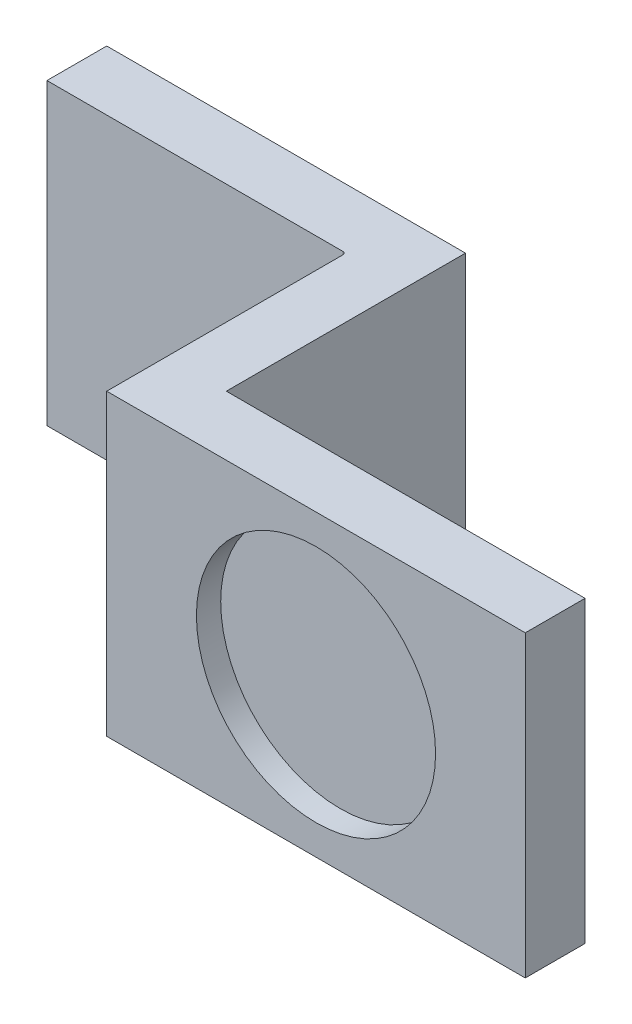
ISO-10303-21;
HEADER;
FILE_DESCRIPTION(('STEP AP214'),'2;1');
FILE_NAME('part.step','',(''),(''),'','','');
FILE_SCHEMA(('AUTOMOTIVE_DESIGN { 1 0 10303 214 1 1 1 1 }'));
ENDSEC;
DATA;
#1=APPLICATION_CONTEXT('core data for automotive mechanical design processes');
#2=APPLICATION_PROTOCOL_DEFINITION('international standard','automotive_design',2000,#1);
#3=PRODUCT_CONTEXT('',#1,'mechanical');
#4=PRODUCT('Part','Part','',(#3));
#5=PRODUCT_RELATED_PRODUCT_CATEGORY('part','',(#4));
#6=PRODUCT_DEFINITION_FORMATION('','',#4);
#7=PRODUCT_DEFINITION_CONTEXT('part definition',#1,'design');
#8=PRODUCT_DEFINITION('design','',#6,#7);
#9=PRODUCT_DEFINITION_SHAPE('','',#8);
#10=(LENGTH_UNIT() NAMED_UNIT(*) SI_UNIT(.MILLI.,.METRE.));
#11=(NAMED_UNIT(*) PLANE_ANGLE_UNIT() SI_UNIT($,.RADIAN.));
#12=(NAMED_UNIT(*) SI_UNIT($,.STERADIAN.) SOLID_ANGLE_UNIT());
#13=UNCERTAINTY_MEASURE_WITH_UNIT(LENGTH_MEASURE(1.E-05),#10,'distance_accuracy_value','');
#14=(GEOMETRIC_REPRESENTATION_CONTEXT(3) GLOBAL_UNCERTAINTY_ASSIGNED_CONTEXT((#13)) GLOBAL_UNIT_ASSIGNED_CONTEXT((#10,
#11,#12)) REPRESENTATION_CONTEXT('',''));
#15=CARTESIAN_POINT('',(0.,0.,0.));
#16=DIRECTION('',(0.,0.,1.));
#17=DIRECTION('',(1.,0.,0.));
#18=AXIS2_PLACEMENT_3D('',#15,#16,#17);
#19=CARTESIAN_POINT('',(15.,12.5,5.));
#20=DIRECTION('',(-1.,0.,0.));
#21=DIRECTION('',(0.,-1.,0.));
#22=AXIS2_PLACEMENT_3D('',#19,#20,#21);
#23=PLANE('',#22);
#24=DIRECTION('',(0.,1.,0.));
#25=VECTOR('',#24,1.);
#26=CARTESIAN_POINT('',(15.,12.5,20.));
#27=LINE('',#26,#25);
#28=CARTESIAN_POINT('',(15.,-12.5,20.));
#29=VERTEX_POINT('',#28);
#30=CARTESIAN_POINT('',(15.,12.5,20.));
#31=VERTEX_POINT('',#30);
#32=EDGE_CURVE('E141',#29,#31,#27,.T.);
#33=ORIENTED_EDGE('',*,*,#32,.F.);
#34=DIRECTION('',(0.,0.,-1.));
#35=VECTOR('',#34,1.);
#36=CARTESIAN_POINT('',(15.,-12.5,5.));
#37=LINE('',#36,#35);
#38=CARTESIAN_POINT('',(15.,-12.5,0.));
#39=VERTEX_POINT('',#38);
#40=EDGE_CURVE('E182',#29,#39,#37,.T.);
#41=ORIENTED_EDGE('',*,*,#40,.T.);
#42=DIRECTION('',(0.,1.,0.));
#43=VECTOR('',#42,1.);
#44=CARTESIAN_POINT('',(15.,12.5,0.));
#45=LINE('',#44,#43);
#46=CARTESIAN_POINT('',(15.,12.5,0.));
#47=VERTEX_POINT('',#46);
#48=EDGE_CURVE('E170',#39,#47,#45,.T.);
#49=ORIENTED_EDGE('',*,*,#48,.T.);
#50=DIRECTION('',(0.,0.,-1.));
#51=VECTOR('',#50,1.);
#52=CARTESIAN_POINT('',(15.,12.5,5.));
#53=LINE('',#52,#51);
#54=EDGE_CURVE('E204',#31,#47,#53,.T.);
#55=ORIENTED_EDGE('',*,*,#54,.F.);
#56=EDGE_LOOP('',(#33,#41,#49,#55));
#57=FACE_BOUND('',#56,.T.);
#58=ADVANCED_FACE('F41',(#57),#23,.F.);
#59=CARTESIAN_POINT('',(-15.,12.5,5.));
#60=DIRECTION('',(0.,-1.,0.));
#61=DIRECTION('',(0.,0.,-1.));
#62=AXIS2_PLACEMENT_3D('',#59,#60,#61);
#63=PLANE('',#62);
#64=DIRECTION('',(-1.,0.,0.));
#65=VECTOR('',#64,1.);
#66=CARTESIAN_POINT('',(-15.,12.5,0.));
#67=LINE('',#66,#65);
#68=CARTESIAN_POINT('',(-15.,12.5,0.));
#69=VERTEX_POINT('',#68);
#70=EDGE_CURVE('E186',#47,#69,#67,.T.);
#71=ORIENTED_EDGE('',*,*,#70,.T.);
#72=DIRECTION('',(0.,0.,-1.));
#73=VECTOR('',#72,1.);
#74=CARTESIAN_POINT('',(-15.,12.5,5.));
#75=LINE('',#74,#73);
#76=CARTESIAN_POINT('',(-15.,12.5,5.));
#77=VERTEX_POINT('',#76);
#78=EDGE_CURVE('E200',#77,#69,#75,.T.);
#79=ORIENTED_EDGE('',*,*,#78,.F.);
#80=DIRECTION('',(-1.,0.,0.));
#81=VECTOR('',#80,1.);
#82=CARTESIAN_POINT('',(-15.,12.5,5.));
#83=LINE('',#82,#81);
#84=CARTESIAN_POINT('',(9.75,12.5,5.));
#85=VERTEX_POINT('',#84);
#86=EDGE_CURVE('E172',#85,#77,#83,.T.);
#87=ORIENTED_EDGE('',*,*,#86,.F.);
#88=CARTESIAN_POINT('',(9.75,12.5,5.25));
#89=DIRECTION('',(0.,-1.,0.));
#90=DIRECTION('',(0.,0.,-1.));
#91=AXIS2_PLACEMENT_3D('',#88,#89,#90);
#92=CIRCLE('',#91,0.25);
#93=CARTESIAN_POINT('',(10.,12.5,5.25));
#94=VERTEX_POINT('',#93);
#95=EDGE_CURVE('E11',#85,#94,#92,.T.);
#96=ORIENTED_EDGE('',*,*,#95,.T.);
#97=DIRECTION('',(0.,0.,-1.));
#98=VECTOR('',#97,1.);
#99=CARTESIAN_POINT('',(10.,12.5,0.));
#100=LINE('',#99,#98);
#101=CARTESIAN_POINT('',(10.,12.5,25.));
#102=VERTEX_POINT('',#101);
#103=EDGE_CURVE('E122',#102,#94,#100,.T.);
#104=ORIENTED_EDGE('',*,*,#103,.F.);
#105=DIRECTION('',(1.,0.,0.));
#106=VECTOR('',#105,1.);
#107=CARTESIAN_POINT('',(10.,12.5,25.));
#108=LINE('',#107,#106);
#109=CARTESIAN_POINT('',(45.,12.5,25.));
#110=VERTEX_POINT('',#109);
#111=EDGE_CURVE('E121',#102,#110,#108,.T.);
#112=ORIENTED_EDGE('',*,*,#111,.T.);
#113=DIRECTION('',(0.,0.,1.));
#114=VECTOR('',#113,1.);
#115=CARTESIAN_POINT('',(45.,12.5,20.));
#116=LINE('',#115,#114);
#117=CARTESIAN_POINT('',(45.,12.5,20.));
#118=VERTEX_POINT('',#117);
#119=EDGE_CURVE('E139',#118,#110,#116,.T.);
#120=ORIENTED_EDGE('',*,*,#119,.F.);
#121=DIRECTION('',(-1.,0.,0.));
#122=VECTOR('',#121,1.);
#123=CARTESIAN_POINT('',(45.,12.5,20.));
#124=LINE('',#123,#122);
#125=EDGE_CURVE('E154',#118,#31,#124,.T.);
#126=ORIENTED_EDGE('',*,*,#125,.T.);
#127=ORIENTED_EDGE('',*,*,#54,.T.);
#128=EDGE_LOOP('',(#71,#79,#87,#96,#104,#112,#120,#126,#127));
#129=FACE_BOUND('',#128,.T.);
#130=ADVANCED_FACE('F220',(#129),#63,.F.);
#131=CARTESIAN_POINT('',(-15.,12.5,5.));
#132=DIRECTION('',(1.,0.,0.));
#133=DIRECTION('',(0.,1.,0.));
#134=AXIS2_PLACEMENT_3D('',#131,#132,#133);
#135=PLANE('',#134);
#136=DIRECTION('',(0.,-1.,0.));
#137=VECTOR('',#136,1.);
#138=CARTESIAN_POINT('',(-15.,12.5,0.));
#139=LINE('',#138,#137);
#140=CARTESIAN_POINT('',(-15.,-12.5,0.));
#141=VERTEX_POINT('',#140);
#142=EDGE_CURVE('E189',#69,#141,#139,.T.);
#143=ORIENTED_EDGE('',*,*,#142,.T.);
#144=DIRECTION('',(0.,0.,-1.));
#145=VECTOR('',#144,1.);
#146=CARTESIAN_POINT('',(-15.,-12.5,5.));
#147=LINE('',#146,#145);
#148=CARTESIAN_POINT('',(-15.,-12.5,5.));
#149=VERTEX_POINT('',#148);
#150=EDGE_CURVE('E196',#149,#141,#147,.T.);
#151=ORIENTED_EDGE('',*,*,#150,.F.);
#152=DIRECTION('',(0.,-1.,0.));
#153=VECTOR('',#152,1.);
#154=CARTESIAN_POINT('',(-15.,12.5,5.));
#155=LINE('',#154,#153);
#156=EDGE_CURVE('E175',#77,#149,#155,.T.);
#157=ORIENTED_EDGE('',*,*,#156,.F.);
#158=ORIENTED_EDGE('',*,*,#78,.T.);
#159=EDGE_LOOP('',(#143,#151,#157,#158));
#160=FACE_BOUND('',#159,.T.);
#161=ADVANCED_FACE('F226',(#160),#135,.F.);
#162=CARTESIAN_POINT('',(-15.,-12.5,5.));
#163=DIRECTION('',(0.,1.,0.));
#164=DIRECTION('',(0.,0.,1.));
#165=AXIS2_PLACEMENT_3D('',#162,#163,#164);
#166=PLANE('',#165);
#167=DIRECTION('',(1.,0.,0.));
#168=VECTOR('',#167,1.);
#169=CARTESIAN_POINT('',(-15.,-12.5,0.));
#170=LINE('',#169,#168);
#171=EDGE_CURVE('E176',#141,#39,#170,.T.);
#172=ORIENTED_EDGE('',*,*,#171,.T.);
#173=ORIENTED_EDGE('',*,*,#40,.F.);
#174=DIRECTION('',(-1.,0.,0.));
#175=VECTOR('',#174,1.);
#176=CARTESIAN_POINT('',(45.,-12.5,20.));
#177=LINE('',#176,#175);
#178=CARTESIAN_POINT('',(45.,-12.5,20.));
#179=VERTEX_POINT('',#178);
#180=EDGE_CURVE('E130',#179,#29,#177,.T.);
#181=ORIENTED_EDGE('',*,*,#180,.F.);
#182=DIRECTION('',(0.,0.,-1.));
#183=VECTOR('',#182,1.);
#184=CARTESIAN_POINT('',(45.,-12.5,20.));
#185=LINE('',#184,#183);
#186=CARTESIAN_POINT('',(45.,-12.5,25.));
#187=VERTEX_POINT('',#186);
#188=EDGE_CURVE('E125',#187,#179,#185,.T.);
#189=ORIENTED_EDGE('',*,*,#188,.F.);
#190=DIRECTION('',(1.,0.,0.));
#191=VECTOR('',#190,1.);
#192=CARTESIAN_POINT('',(10.,-12.5,25.));
#193=LINE('',#192,#191);
#194=CARTESIAN_POINT('',(10.,-12.5,25.));
#195=VERTEX_POINT('',#194);
#196=EDGE_CURVE('E112',#195,#187,#193,.T.);
#197=ORIENTED_EDGE('',*,*,#196,.F.);
#198=DIRECTION('',(0.,0.,-1.));
#199=VECTOR('',#198,1.);
#200=CARTESIAN_POINT('',(10.,-12.5,0.));
#201=LINE('',#200,#199);
#202=CARTESIAN_POINT('',(10.,-12.5,5.25));
#203=VERTEX_POINT('',#202);
#204=EDGE_CURVE('E163',#195,#203,#201,.T.);
#205=ORIENTED_EDGE('',*,*,#204,.T.);
#206=CARTESIAN_POINT('',(9.75,-12.5,5.25));
#207=DIRECTION('',(0.,1.,0.));
#208=DIRECTION('',(0.,0.,1.));
#209=AXIS2_PLACEMENT_3D('',#206,#207,#208);
#210=CIRCLE('',#209,0.25);
#211=CARTESIAN_POINT('',(9.75,-12.5,5.));
#212=VERTEX_POINT('',#211);
#213=EDGE_CURVE('E50',#203,#212,#210,.T.);
#214=ORIENTED_EDGE('',*,*,#213,.T.);
#215=DIRECTION('',(1.,0.,0.));
#216=VECTOR('',#215,1.);
#217=CARTESIAN_POINT('',(-15.,-12.5,5.));
#218=LINE('',#217,#216);
#219=EDGE_CURVE('E179',#149,#212,#218,.T.);
#220=ORIENTED_EDGE('',*,*,#219,.F.);
#221=ORIENTED_EDGE('',*,*,#150,.T.);
#222=EDGE_LOOP('',(#172,#173,#181,#189,#197,#205,#214,#220,#221));
#223=FACE_BOUND('',#222,.T.);
#224=ADVANCED_FACE('F127',(#223),#166,.F.);
#225=CARTESIAN_POINT('',(0.,0.,5.));
#226=DIRECTION('',(0.,0.,1.));
#227=DIRECTION('',(1.,0.,0.));
#228=AXIS2_PLACEMENT_3D('',#225,#226,#227);
#229=PLANE('',#228);
#230=ORIENTED_EDGE('',*,*,#219,.T.);
#231=DIRECTION('',(0.,-1.,0.));
#232=VECTOR('',#231,1.);
#233=CARTESIAN_POINT('',(9.75,0.,5.));
#234=LINE('',#233,#232);
#235=EDGE_CURVE('E63',#212,#85,#234,.F.);
#236=ORIENTED_EDGE('',*,*,#235,.T.);
#237=ORIENTED_EDGE('',*,*,#86,.T.);
#238=ORIENTED_EDGE('',*,*,#156,.T.);
#239=EDGE_LOOP('',(#230,#236,#237,#238));
#240=FACE_BOUND('',#239,.T.);
#241=ADVANCED_FACE('F223',(#240),#229,.T.);
#242=CARTESIAN_POINT('',(0.,0.,0.));
#243=DIRECTION('',(0.,0.,1.));
#244=DIRECTION('',(1.,0.,0.));
#245=AXIS2_PLACEMENT_3D('',#242,#243,#244);
#246=PLANE('',#245);
#247=ORIENTED_EDGE('',*,*,#48,.F.);
#248=ORIENTED_EDGE('',*,*,#171,.F.);
#249=ORIENTED_EDGE('',*,*,#142,.F.);
#250=ORIENTED_EDGE('',*,*,#70,.F.);
#251=EDGE_LOOP('',(#247,#248,#249,#250));
#252=FACE_BOUND('',#251,.T.);
#253=ADVANCED_FACE('F231',(#252),#246,.F.);
#254=CARTESIAN_POINT('',(10.,0.,25.));
#255=DIRECTION('',(0.,0.,1.));
#256=DIRECTION('',(0.,-1.,0.));
#257=AXIS2_PLACEMENT_3D('',#254,#255,#256);
#258=PLANE('',#257);
#259=CARTESIAN_POINT('',(27.5,0.,25.));
#260=DIRECTION('',(0.,0.,1.));
#261=DIRECTION('',(1.,0.,0.));
#262=AXIS2_PLACEMENT_3D('',#259,#260,#261);
#263=CIRCLE('',#262,10.);
#264=CARTESIAN_POINT('',(37.5,0.,25.));
#265=VERTEX_POINT('',#264);
#266=EDGE_CURVE('E148',#265,#265,#263,.T.);
#267=ORIENTED_EDGE('',*,*,#266,.F.);
#268=EDGE_LOOP('',(#267));
#269=FACE_BOUND('',#268,.T.);
#270=ORIENTED_EDGE('',*,*,#196,.T.);
#271=DIRECTION('',(0.,-1.,0.));
#272=VECTOR('',#271,1.);
#273=CARTESIAN_POINT('',(45.,12.5,25.));
#274=LINE('',#273,#272);
#275=EDGE_CURVE('E116',#110,#187,#274,.T.);
#276=ORIENTED_EDGE('',*,*,#275,.F.);
#277=ORIENTED_EDGE('',*,*,#111,.F.);
#278=DIRECTION('',(0.,-1.,0.));
#279=VECTOR('',#278,1.);
#280=CARTESIAN_POINT('',(10.,0.,25.));
#281=LINE('',#280,#279);
#282=EDGE_CURVE('E118',#102,#195,#281,.T.);
#283=ORIENTED_EDGE('',*,*,#282,.T.);
#284=EDGE_LOOP('',(#270,#276,#277,#283));
#285=FACE_BOUND('',#284,.T.);
#286=ADVANCED_FACE('F114',(#269,#285),#258,.T.);
#287=CARTESIAN_POINT('',(10.,0.,0.));
#288=DIRECTION('',(1.,0.,0.));
#289=DIRECTION('',(0.,1.,0.));
#290=AXIS2_PLACEMENT_3D('',#287,#288,#289);
#291=PLANE('',#290);
#292=ORIENTED_EDGE('',*,*,#103,.T.);
#293=DIRECTION('',(0.,-1.,0.));
#294=VECTOR('',#293,1.);
#295=CARTESIAN_POINT('',(10.,0.,5.25));
#296=LINE('',#295,#294);
#297=EDGE_CURVE('E207',#94,#203,#296,.T.);
#298=ORIENTED_EDGE('',*,*,#297,.T.);
#299=ORIENTED_EDGE('',*,*,#204,.F.);
#300=ORIENTED_EDGE('',*,*,#282,.F.);
#301=EDGE_LOOP('',(#292,#298,#299,#300));
#302=FACE_BOUND('',#301,.T.);
#303=ADVANCED_FACE('F215',(#302),#291,.F.);
#304=CARTESIAN_POINT('',(45.,12.5,20.));
#305=DIRECTION('',(0.,0.,1.));
#306=DIRECTION('',(1.,0.,0.));
#307=AXIS2_PLACEMENT_3D('',#304,#305,#306);
#308=PLANE('',#307);
#309=ORIENTED_EDGE('',*,*,#32,.T.);
#310=ORIENTED_EDGE('',*,*,#125,.F.);
#311=DIRECTION('',(0.,1.,0.));
#312=VECTOR('',#311,1.);
#313=CARTESIAN_POINT('',(45.,12.5,20.));
#314=LINE('',#313,#312);
#315=EDGE_CURVE('E134',#179,#118,#314,.T.);
#316=ORIENTED_EDGE('',*,*,#315,.F.);
#317=ORIENTED_EDGE('',*,*,#180,.T.);
#318=EDGE_LOOP('',(#309,#310,#316,#317));
#319=FACE_BOUND('',#318,.T.);
#320=ADVANCED_FACE('F235',(#319),#308,.F.);
#321=CARTESIAN_POINT('',(45.,0.,0.));
#322=DIRECTION('',(-1.,0.,0.));
#323=DIRECTION('',(0.,-1.,0.));
#324=AXIS2_PLACEMENT_3D('',#321,#322,#323);
#325=PLANE('',#324);
#326=ORIENTED_EDGE('',*,*,#275,.T.);
#327=ORIENTED_EDGE('',*,*,#188,.T.);
#328=ORIENTED_EDGE('',*,*,#315,.T.);
#329=ORIENTED_EDGE('',*,*,#119,.T.);
#330=EDGE_LOOP('',(#326,#327,#328,#329));
#331=FACE_BOUND('',#330,.T.);
#332=ADVANCED_FACE('F137',(#331),#325,.F.);
#333=CARTESIAN_POINT('',(9.75,0.,5.25));
#334=DIRECTION('',(0.,-1.,0.));
#335=DIRECTION('',(1.,0.,0.));
#336=AXIS2_PLACEMENT_3D('',#333,#334,#335);
#337=CYLINDRICAL_SURFACE('',#336,0.25);
#338=ORIENTED_EDGE('',*,*,#95,.F.);
#339=ORIENTED_EDGE('',*,*,#235,.F.);
#340=ORIENTED_EDGE('',*,*,#213,.F.);
#341=ORIENTED_EDGE('',*,*,#297,.F.);
#342=EDGE_LOOP('',(#338,#339,#340,#341));
#343=FACE_BOUND('',#342,.T.);
#344=ADVANCED_FACE('F43',(#343),#337,.F.);
#345=CARTESIAN_POINT('',(27.5,0.,22.97));
#346=DIRECTION('',(0.,0.,1.));
#347=DIRECTION('',(1.,0.,0.));
#348=AXIS2_PLACEMENT_3D('',#345,#346,#347);
#349=CYLINDRICAL_SURFACE('',#348,10.);
#350=CARTESIAN_POINT('',(27.5,0.,22.97));
#351=DIRECTION('',(0.,0.,1.));
#352=DIRECTION('',(1.,0.,0.));
#353=AXIS2_PLACEMENT_3D('',#350,#351,#352);
#354=CIRCLE('',#353,10.);
#355=CARTESIAN_POINT('',(37.5,0.,22.97));
#356=VERTEX_POINT('',#355);
#357=EDGE_CURVE('E145',#356,#356,#354,.T.);
#358=ORIENTED_EDGE('',*,*,#357,.F.);
#359=EDGE_LOOP('',(#358));
#360=FACE_BOUND('',#359,.T.);
#361=ORIENTED_EDGE('',*,*,#266,.T.);
#362=EDGE_LOOP('',(#361));
#363=FACE_BOUND('',#362,.T.);
#364=ADVANCED_FACE('F273',(#360,#363),#349,.F.);
#365=CARTESIAN_POINT('',(27.5,0.,22.97));
#366=DIRECTION('',(0.,0.,1.));
#367=DIRECTION('',(1.,0.,0.));
#368=AXIS2_PLACEMENT_3D('',#365,#366,#367);
#369=PLANE('',#368);
#370=ORIENTED_EDGE('',*,*,#357,.T.);
#371=EDGE_LOOP('',(#370));
#372=FACE_BOUND('',#371,.T.);
#373=ADVANCED_FACE('F271',(#372),#369,.T.);
#374=CLOSED_SHELL('',(#58,#130,#161,#224,#241,#253,#286,#303,#320,#332,#344,#364,#373));
#375=MANIFOLD_SOLID_BREP('B2',#374);
#376=ADVANCED_BREP_SHAPE_REPRESENTATION('',(#18,#375),#14);
#377=SHAPE_DEFINITION_REPRESENTATION(#9,#376);
ENDSEC;
END-ISO-10303-21;
